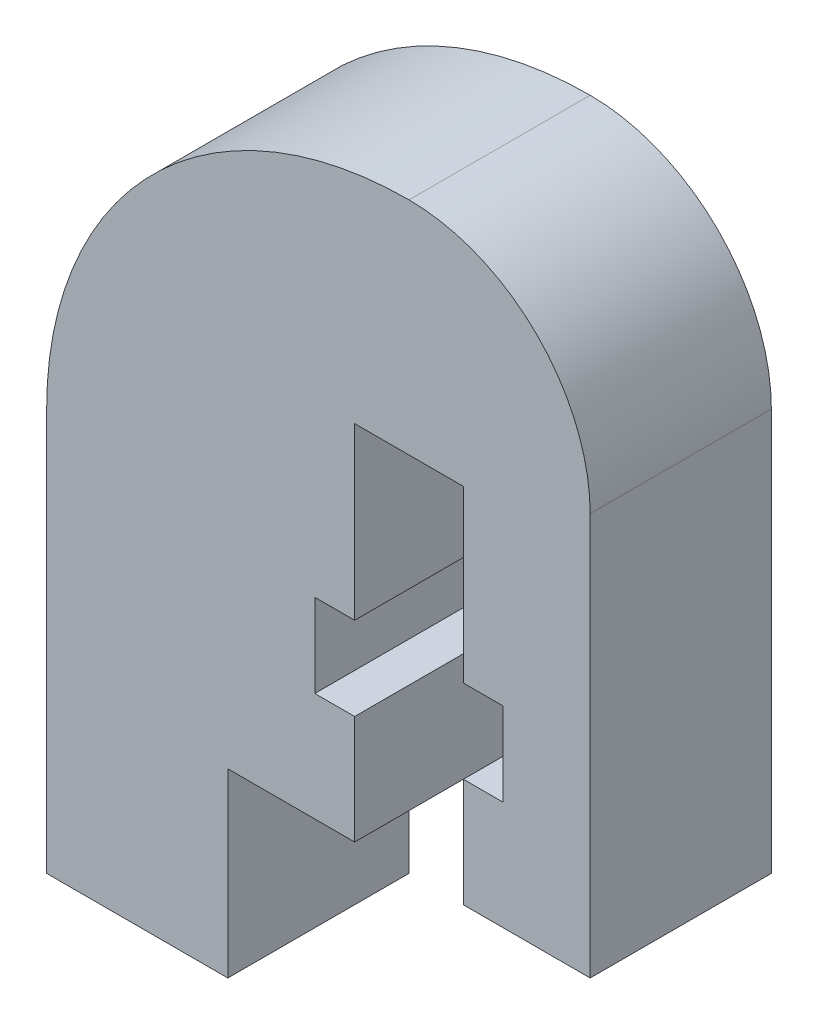
ISO-10303-21;
HEADER;
FILE_DESCRIPTION(('STEP AP214'),'2;1');
FILE_NAME('part.step','',(''),(''),'','','');
FILE_SCHEMA(('AUTOMOTIVE_DESIGN { 1 0 10303 214 1 1 1 1 }'));
ENDSEC;
DATA;
#1=APPLICATION_CONTEXT('core data for automotive mechanical design processes');
#2=APPLICATION_PROTOCOL_DEFINITION('international standard','automotive_design',2000,#1);
#3=PRODUCT_CONTEXT('',#1,'mechanical');
#4=PRODUCT('Part','Part','',(#3));
#5=PRODUCT_RELATED_PRODUCT_CATEGORY('part','',(#4));
#6=PRODUCT_DEFINITION_FORMATION('','',#4);
#7=PRODUCT_DEFINITION_CONTEXT('part definition',#1,'design');
#8=PRODUCT_DEFINITION('design','',#6,#7);
#9=PRODUCT_DEFINITION_SHAPE('','',#8);
#10=(LENGTH_UNIT() NAMED_UNIT(*) SI_UNIT(.MILLI.,.METRE.));
#11=(NAMED_UNIT(*) PLANE_ANGLE_UNIT() SI_UNIT($,.RADIAN.));
#12=(NAMED_UNIT(*) SI_UNIT($,.STERADIAN.) SOLID_ANGLE_UNIT());
#13=UNCERTAINTY_MEASURE_WITH_UNIT(LENGTH_MEASURE(1.E-05),#10,'distance_accuracy_value','');
#14=(GEOMETRIC_REPRESENTATION_CONTEXT(3) GLOBAL_UNCERTAINTY_ASSIGNED_CONTEXT((#13)) GLOBAL_UNIT_ASSIGNED_CONTEXT((#10,
#11,#12)) REPRESENTATION_CONTEXT('',''));
#15=CARTESIAN_POINT('',(0.,0.,0.));
#16=DIRECTION('',(0.,0.,1.));
#17=DIRECTION('',(1.,0.,0.));
#18=AXIS2_PLACEMENT_3D('',#15,#16,#17);
#19=CARTESIAN_POINT('',(-18.4847998634987,8.,5.));
#20=DIRECTION('',(-1.,0.,0.));
#21=DIRECTION('',(0.,0.,1.));
#22=AXIS2_PLACEMENT_3D('',#19,#20,#21);
#23=PLANE('',#22);
#24=DIRECTION('',(0.,1.,0.));
#25=VECTOR('',#24,1.);
#26=CARTESIAN_POINT('',(-18.4847998634987,8.,0.));
#27=LINE('',#26,#25);
#28=CARTESIAN_POINT('',(-18.4847998634987,5.,0.));
#29=VERTEX_POINT('',#28);
#30=CARTESIAN_POINT('',(-18.4847998634987,8.,0.));
#31=VERTEX_POINT('',#30);
#32=EDGE_CURVE('E187',#29,#31,#27,.T.);
#33=ORIENTED_EDGE('',*,*,#32,.T.);
#34=DIRECTION('',(0.,0.,-1.));
#35=VECTOR('',#34,1.);
#36=CARTESIAN_POINT('',(-18.4847998634987,8.,5.));
#37=LINE('',#36,#35);
#38=CARTESIAN_POINT('',(-18.4847998634987,8.,5.));
#39=VERTEX_POINT('',#38);
#40=EDGE_CURVE('E168',#39,#31,#37,.T.);
#41=ORIENTED_EDGE('',*,*,#40,.F.);
#42=DIRECTION('',(0.,1.,0.));
#43=VECTOR('',#42,1.);
#44=CARTESIAN_POINT('',(-18.4847998634987,8.,5.));
#45=LINE('',#44,#43);
#46=CARTESIAN_POINT('',(-18.4847998634987,5.,5.));
#47=VERTEX_POINT('',#46);
#48=EDGE_CURVE('E175',#47,#39,#45,.T.);
#49=ORIENTED_EDGE('',*,*,#48,.F.);
#50=DIRECTION('',(0.,0.,-1.));
#51=VECTOR('',#50,1.);
#52=CARTESIAN_POINT('',(-18.4847998634987,5.,5.));
#53=LINE('',#52,#51);
#54=EDGE_CURVE('E236',#47,#29,#53,.T.);
#55=ORIENTED_EDGE('',*,*,#54,.T.);
#56=EDGE_LOOP('',(#33,#41,#49,#55));
#57=FACE_BOUND('',#56,.T.);
#58=ADVANCED_FACE('F33',(#57),#23,.F.);
#59=CARTESIAN_POINT('',(-18.4847998634987,8.,5.));
#60=DIRECTION('',(0.,-1.,0.));
#61=DIRECTION('',(1.,0.,0.));
#62=AXIS2_PLACEMENT_3D('',#59,#60,#61);
#63=PLANE('',#62);
#64=DIRECTION('',(-1.,0.,0.));
#65=VECTOR('',#64,1.);
#66=CARTESIAN_POINT('',(-18.4847998634987,8.,0.));
#67=LINE('',#66,#65);
#68=CARTESIAN_POINT('',(-19.5847998634987,8.00000000000001,0.));
#69=VERTEX_POINT('',#68);
#70=EDGE_CURVE('E289',#31,#69,#67,.T.);
#71=ORIENTED_EDGE('',*,*,#70,.T.);
#72=DIRECTION('',(0.,0.,-1.));
#73=VECTOR('',#72,1.);
#74=CARTESIAN_POINT('',(-19.5847998634987,8.00000000000001,5.));
#75=LINE('',#74,#73);
#76=CARTESIAN_POINT('',(-19.5847998634987,8.00000000000001,5.));
#77=VERTEX_POINT('',#76);
#78=EDGE_CURVE('E171',#77,#69,#75,.T.);
#79=ORIENTED_EDGE('',*,*,#78,.F.);
#80=DIRECTION('',(-1.,0.,0.));
#81=VECTOR('',#80,1.);
#82=CARTESIAN_POINT('',(-18.4847998634987,8.,5.));
#83=LINE('',#82,#81);
#84=EDGE_CURVE('E164',#39,#77,#83,.T.);
#85=ORIENTED_EDGE('',*,*,#84,.F.);
#86=ORIENTED_EDGE('',*,*,#40,.T.);
#87=EDGE_LOOP('',(#71,#79,#85,#86));
#88=FACE_BOUND('',#87,.T.);
#89=ADVANCED_FACE('F166',(#88),#63,.F.);
#90=CARTESIAN_POINT('',(-19.5847998634987,8.00000000000001,5.));
#91=DIRECTION('',(-1.,0.,0.));
#92=DIRECTION('',(0.,0.,1.));
#93=AXIS2_PLACEMENT_3D('',#90,#91,#92);
#94=PLANE('',#93);
#95=DIRECTION('',(0.,1.,0.));
#96=VECTOR('',#95,1.);
#97=CARTESIAN_POINT('',(-19.5847998634987,8.00000000000001,0.));
#98=LINE('',#97,#96);
#99=CARTESIAN_POINT('',(-19.5847998634987,10.3,0.));
#100=VERTEX_POINT('',#99);
#101=EDGE_CURVE('E283',#69,#100,#98,.T.);
#102=ORIENTED_EDGE('',*,*,#101,.T.);
#103=DIRECTION('',(0.,0.,-1.));
#104=VECTOR('',#103,1.);
#105=CARTESIAN_POINT('',(-19.5847998634987,10.3,5.));
#106=LINE('',#105,#104);
#107=CARTESIAN_POINT('',(-19.5847998634987,10.3,5.));
#108=VERTEX_POINT('',#107);
#109=EDGE_CURVE('E193',#108,#100,#106,.T.);
#110=ORIENTED_EDGE('',*,*,#109,.F.);
#111=DIRECTION('',(0.,1.,0.));
#112=VECTOR('',#111,1.);
#113=CARTESIAN_POINT('',(-19.5847998634987,8.00000000000001,5.));
#114=LINE('',#113,#112);
#115=EDGE_CURVE('E174',#77,#108,#114,.T.);
#116=ORIENTED_EDGE('',*,*,#115,.F.);
#117=ORIENTED_EDGE('',*,*,#78,.T.);
#118=EDGE_LOOP('',(#102,#110,#116,#117));
#119=FACE_BOUND('',#118,.T.);
#120=ADVANCED_FACE('F321',(#119),#94,.F.);
#121=CARTESIAN_POINT('',(-19.5847998634987,10.3,5.));
#122=DIRECTION('',(0.,1.,0.));
#123=DIRECTION('',(-1.,0.,0.));
#124=AXIS2_PLACEMENT_3D('',#121,#122,#123);
#125=PLANE('',#124);
#126=DIRECTION('',(1.,0.,0.));
#127=VECTOR('',#126,1.);
#128=CARTESIAN_POINT('',(-19.5847998634987,10.3,0.));
#129=LINE('',#128,#127);
#130=CARTESIAN_POINT('',(-18.4847998634987,10.3,0.));
#131=VERTEX_POINT('',#130);
#132=EDGE_CURVE('E278',#100,#131,#129,.T.);
#133=ORIENTED_EDGE('',*,*,#132,.T.);
#134=DIRECTION('',(0.,0.,-1.));
#135=VECTOR('',#134,1.);
#136=CARTESIAN_POINT('',(-18.4847998634987,10.3,5.));
#137=LINE('',#136,#135);
#138=CARTESIAN_POINT('',(-18.4847998634987,10.3,5.));
#139=VERTEX_POINT('',#138);
#140=EDGE_CURVE('E269',#139,#131,#137,.T.);
#141=ORIENTED_EDGE('',*,*,#140,.F.);
#142=DIRECTION('',(1.,0.,0.));
#143=VECTOR('',#142,1.);
#144=CARTESIAN_POINT('',(-19.5847998634987,10.3,5.));
#145=LINE('',#144,#143);
#146=EDGE_CURVE('E279',#108,#139,#145,.T.);
#147=ORIENTED_EDGE('',*,*,#146,.F.);
#148=ORIENTED_EDGE('',*,*,#109,.T.);
#149=EDGE_LOOP('',(#133,#141,#147,#148));
#150=FACE_BOUND('',#149,.T.);
#151=ADVANCED_FACE('F276',(#150),#125,.F.);
#152=CARTESIAN_POINT('',(-18.4847998634987,15.,5.));
#153=DIRECTION('',(-1.,0.,0.));
#154=DIRECTION('',(0.,0.,1.));
#155=AXIS2_PLACEMENT_3D('',#152,#153,#154);
#156=PLANE('',#155);
#157=DIRECTION('',(0.,1.,0.));
#158=VECTOR('',#157,1.);
#159=CARTESIAN_POINT('',(-18.4847998634987,15.,0.));
#160=LINE('',#159,#158);
#161=CARTESIAN_POINT('',(-18.4847998634987,15.,0.));
#162=VERTEX_POINT('',#161);
#163=EDGE_CURVE('E285',#131,#162,#160,.T.);
#164=ORIENTED_EDGE('',*,*,#163,.T.);
#165=DIRECTION('',(0.,0.,-1.));
#166=VECTOR('',#165,1.);
#167=CARTESIAN_POINT('',(-18.4847998634987,15.,5.));
#168=LINE('',#167,#166);
#169=CARTESIAN_POINT('',(-18.4847998634987,15.,5.));
#170=VERTEX_POINT('',#169);
#171=EDGE_CURVE('E266',#170,#162,#168,.T.);
#172=ORIENTED_EDGE('',*,*,#171,.F.);
#173=DIRECTION('',(0.,1.,0.));
#174=VECTOR('',#173,1.);
#175=CARTESIAN_POINT('',(-18.4847998634987,15.,5.));
#176=LINE('',#175,#174);
#177=EDGE_CURVE('E323',#139,#170,#176,.T.);
#178=ORIENTED_EDGE('',*,*,#177,.F.);
#179=ORIENTED_EDGE('',*,*,#140,.T.);
#180=EDGE_LOOP('',(#164,#172,#178,#179));
#181=FACE_BOUND('',#180,.T.);
#182=ADVANCED_FACE('F366',(#181),#156,.F.);
#183=CARTESIAN_POINT('',(-15.4847998634987,15.,5.));
#184=DIRECTION('',(0.,1.,0.));
#185=DIRECTION('',(0.,0.,1.));
#186=AXIS2_PLACEMENT_3D('',#183,#184,#185);
#187=PLANE('',#186);
#188=DIRECTION('',(1.,0.,0.));
#189=VECTOR('',#188,1.);
#190=CARTESIAN_POINT('',(-15.4847998634987,15.,0.));
#191=LINE('',#190,#189);
#192=CARTESIAN_POINT('',(-15.4847998634987,15.,0.));
#193=VERTEX_POINT('',#192);
#194=EDGE_CURVE('E287',#162,#193,#191,.T.);
#195=ORIENTED_EDGE('',*,*,#194,.T.);
#196=DIRECTION('',(0.,0.,-1.));
#197=VECTOR('',#196,1.);
#198=CARTESIAN_POINT('',(-15.4847998634987,15.,5.));
#199=LINE('',#198,#197);
#200=CARTESIAN_POINT('',(-15.4847998634987,15.,5.));
#201=VERTEX_POINT('',#200);
#202=EDGE_CURVE('E263',#201,#193,#199,.T.);
#203=ORIENTED_EDGE('',*,*,#202,.F.);
#204=DIRECTION('',(1.,0.,0.));
#205=VECTOR('',#204,1.);
#206=CARTESIAN_POINT('',(-15.4847998634987,15.,5.));
#207=LINE('',#206,#205);
#208=EDGE_CURVE('E327',#170,#201,#207,.T.);
#209=ORIENTED_EDGE('',*,*,#208,.F.);
#210=ORIENTED_EDGE('',*,*,#171,.T.);
#211=EDGE_LOOP('',(#195,#203,#209,#210));
#212=FACE_BOUND('',#211,.T.);
#213=ADVANCED_FACE('F362',(#212),#187,.F.);
#214=CARTESIAN_POINT('',(-15.4847998634987,10.3,5.));
#215=DIRECTION('',(1.,0.,0.));
#216=DIRECTION('',(0.,1.,0.));
#217=AXIS2_PLACEMENT_3D('',#214,#215,#216);
#218=PLANE('',#217);
#219=DIRECTION('',(0.,-1.,0.));
#220=VECTOR('',#219,1.);
#221=CARTESIAN_POINT('',(-15.4847998634987,10.3,0.));
#222=LINE('',#221,#220);
#223=CARTESIAN_POINT('',(-15.4847998634987,10.3,0.));
#224=VERTEX_POINT('',#223);
#225=EDGE_CURVE('E294',#193,#224,#222,.T.);
#226=ORIENTED_EDGE('',*,*,#225,.T.);
#227=DIRECTION('',(0.,0.,-1.));
#228=VECTOR('',#227,1.);
#229=CARTESIAN_POINT('',(-15.4847998634987,10.3,5.));
#230=LINE('',#229,#228);
#231=CARTESIAN_POINT('',(-15.4847998634987,10.3,5.));
#232=VERTEX_POINT('',#231);
#233=EDGE_CURVE('E260',#232,#224,#230,.T.);
#234=ORIENTED_EDGE('',*,*,#233,.F.);
#235=DIRECTION('',(0.,-1.,0.));
#236=VECTOR('',#235,1.);
#237=CARTESIAN_POINT('',(-15.4847998634987,10.3,5.));
#238=LINE('',#237,#236);
#239=EDGE_CURVE('E329',#201,#232,#238,.T.);
#240=ORIENTED_EDGE('',*,*,#239,.F.);
#241=ORIENTED_EDGE('',*,*,#202,.T.);
#242=EDGE_LOOP('',(#226,#234,#240,#241));
#243=FACE_BOUND('',#242,.T.);
#244=ADVANCED_FACE('F357',(#243),#218,.F.);
#245=CARTESIAN_POINT('',(-15.4847998634987,10.3,5.));
#246=DIRECTION('',(0.,1.,0.));
#247=DIRECTION('',(-1.,0.,0.));
#248=AXIS2_PLACEMENT_3D('',#245,#246,#247);
#249=PLANE('',#248);
#250=DIRECTION('',(1.,0.,0.));
#251=VECTOR('',#250,1.);
#252=CARTESIAN_POINT('',(-15.4847998634987,10.3,0.));
#253=LINE('',#252,#251);
#254=CARTESIAN_POINT('',(-14.3847998634987,10.3,0.));
#255=VERTEX_POINT('',#254);
#256=EDGE_CURVE('E296',#224,#255,#253,.T.);
#257=ORIENTED_EDGE('',*,*,#256,.T.);
#258=DIRECTION('',(0.,0.,-1.));
#259=VECTOR('',#258,1.);
#260=CARTESIAN_POINT('',(-14.3847998634987,10.3,5.));
#261=LINE('',#260,#259);
#262=CARTESIAN_POINT('',(-14.3847998634987,10.3,5.));
#263=VERTEX_POINT('',#262);
#264=EDGE_CURVE('E257',#263,#255,#261,.T.);
#265=ORIENTED_EDGE('',*,*,#264,.F.);
#266=DIRECTION('',(1.,0.,0.));
#267=VECTOR('',#266,1.);
#268=CARTESIAN_POINT('',(-15.4847998634987,10.3,5.));
#269=LINE('',#268,#267);
#270=EDGE_CURVE('E331',#232,#263,#269,.T.);
#271=ORIENTED_EDGE('',*,*,#270,.F.);
#272=ORIENTED_EDGE('',*,*,#233,.T.);
#273=EDGE_LOOP('',(#257,#265,#271,#272));
#274=FACE_BOUND('',#273,.T.);
#275=ADVANCED_FACE('F353',(#274),#249,.F.);
#276=CARTESIAN_POINT('',(-14.3847998634987,10.3,5.));
#277=DIRECTION('',(1.,0.,0.));
#278=DIRECTION('',(0.,1.,0.));
#279=AXIS2_PLACEMENT_3D('',#276,#277,#278);
#280=PLANE('',#279);
#281=DIRECTION('',(0.,-1.,0.));
#282=VECTOR('',#281,1.);
#283=CARTESIAN_POINT('',(-14.3847998634987,10.3,0.));
#284=LINE('',#283,#282);
#285=CARTESIAN_POINT('',(-14.3847998634987,8.,0.));
#286=VERTEX_POINT('',#285);
#287=EDGE_CURVE('E298',#255,#286,#284,.T.);
#288=ORIENTED_EDGE('',*,*,#287,.T.);
#289=DIRECTION('',(0.,0.,-1.));
#290=VECTOR('',#289,1.);
#291=CARTESIAN_POINT('',(-14.3847998634987,8.,5.));
#292=LINE('',#291,#290);
#293=CARTESIAN_POINT('',(-14.3847998634987,8.,5.));
#294=VERTEX_POINT('',#293);
#295=EDGE_CURVE('E254',#294,#286,#292,.T.);
#296=ORIENTED_EDGE('',*,*,#295,.F.);
#297=DIRECTION('',(0.,-1.,0.));
#298=VECTOR('',#297,1.);
#299=CARTESIAN_POINT('',(-14.3847998634987,10.3,5.));
#300=LINE('',#299,#298);
#301=EDGE_CURVE('E333',#263,#294,#300,.T.);
#302=ORIENTED_EDGE('',*,*,#301,.F.);
#303=ORIENTED_EDGE('',*,*,#264,.T.);
#304=EDGE_LOOP('',(#288,#296,#302,#303));
#305=FACE_BOUND('',#304,.T.);
#306=ADVANCED_FACE('F349',(#305),#280,.F.);
#307=CARTESIAN_POINT('',(-14.3847998634987,8.,5.));
#308=DIRECTION('',(0.,-1.,0.));
#309=DIRECTION('',(0.,0.,-1.));
#310=AXIS2_PLACEMENT_3D('',#307,#308,#309);
#311=PLANE('',#310);
#312=DIRECTION('',(-1.,0.,0.));
#313=VECTOR('',#312,1.);
#314=CARTESIAN_POINT('',(-14.3847998634987,8.,0.));
#315=LINE('',#314,#313);
#316=CARTESIAN_POINT('',(-15.4847998634987,8.,0.));
#317=VERTEX_POINT('',#316);
#318=EDGE_CURVE('E300',#286,#317,#315,.T.);
#319=ORIENTED_EDGE('',*,*,#318,.T.);
#320=DIRECTION('',(0.,0.,-1.));
#321=VECTOR('',#320,1.);
#322=CARTESIAN_POINT('',(-15.4847998634987,8.,5.));
#323=LINE('',#322,#321);
#324=CARTESIAN_POINT('',(-15.4847998634987,8.,5.));
#325=VERTEX_POINT('',#324);
#326=EDGE_CURVE('E251',#325,#317,#323,.T.);
#327=ORIENTED_EDGE('',*,*,#326,.F.);
#328=DIRECTION('',(-1.,0.,0.));
#329=VECTOR('',#328,1.);
#330=CARTESIAN_POINT('',(-14.3847998634987,8.,5.));
#331=LINE('',#330,#329);
#332=EDGE_CURVE('E335',#294,#325,#331,.T.);
#333=ORIENTED_EDGE('',*,*,#332,.F.);
#334=ORIENTED_EDGE('',*,*,#295,.T.);
#335=EDGE_LOOP('',(#319,#327,#333,#334));
#336=FACE_BOUND('',#335,.T.);
#337=ADVANCED_FACE('F345',(#336),#311,.F.);
#338=CARTESIAN_POINT('',(-15.4847998634987,5.,5.));
#339=DIRECTION('',(1.,0.,0.));
#340=DIRECTION('',(0.,1.,0.));
#341=AXIS2_PLACEMENT_3D('',#338,#339,#340);
#342=PLANE('',#341);
#343=DIRECTION('',(0.,-1.,0.));
#344=VECTOR('',#343,1.);
#345=CARTESIAN_POINT('',(-15.4847998634987,5.,0.));
#346=LINE('',#345,#344);
#347=CARTESIAN_POINT('',(-15.4847998634987,5.,0.));
#348=VERTEX_POINT('',#347);
#349=EDGE_CURVE('E302',#317,#348,#346,.T.);
#350=ORIENTED_EDGE('',*,*,#349,.T.);
#351=DIRECTION('',(0.,0.,-1.));
#352=VECTOR('',#351,1.);
#353=CARTESIAN_POINT('',(-15.4847998634987,5.,5.));
#354=LINE('',#353,#352);
#355=CARTESIAN_POINT('',(-15.4847998634987,5.,5.));
#356=VERTEX_POINT('',#355);
#357=EDGE_CURVE('E248',#356,#348,#354,.T.);
#358=ORIENTED_EDGE('',*,*,#357,.F.);
#359=DIRECTION('',(0.,-1.,0.));
#360=VECTOR('',#359,1.);
#361=CARTESIAN_POINT('',(-15.4847998634987,5.,5.));
#362=LINE('',#361,#360);
#363=EDGE_CURVE('E313',#325,#356,#362,.T.);
#364=ORIENTED_EDGE('',*,*,#363,.F.);
#365=ORIENTED_EDGE('',*,*,#326,.T.);
#366=EDGE_LOOP('',(#350,#358,#364,#365));
#367=FACE_BOUND('',#366,.T.);
#368=ADVANCED_FACE('F340',(#367),#342,.F.);
#369=CARTESIAN_POINT('',(-15.4847998634987,5.,5.));
#370=DIRECTION('',(0.,1.,0.));
#371=DIRECTION('',(0.,0.,1.));
#372=AXIS2_PLACEMENT_3D('',#369,#370,#371);
#373=PLANE('',#372);
#374=DIRECTION('',(1.,0.,0.));
#375=VECTOR('',#374,1.);
#376=CARTESIAN_POINT('',(-15.4847998634987,5.,0.));
#377=LINE('',#376,#375);
#378=CARTESIAN_POINT('',(-11.9847998634987,5.,0.));
#379=VERTEX_POINT('',#378);
#380=EDGE_CURVE('E230',#348,#379,#377,.T.);
#381=ORIENTED_EDGE('',*,*,#380,.T.);
#382=DIRECTION('',(0.,0.,-1.));
#383=VECTOR('',#382,1.);
#384=CARTESIAN_POINT('',(-11.9847998634987,5.,5.));
#385=LINE('',#384,#383);
#386=CARTESIAN_POINT('',(-11.9847998634987,5.,5.));
#387=VERTEX_POINT('',#386);
#388=EDGE_CURVE('E245',#387,#379,#385,.T.);
#389=ORIENTED_EDGE('',*,*,#388,.F.);
#390=DIRECTION('',(1.,0.,0.));
#391=VECTOR('',#390,1.);
#392=CARTESIAN_POINT('',(-15.4847998634987,5.,5.));
#393=LINE('',#392,#391);
#394=EDGE_CURVE('E311',#356,#387,#393,.T.);
#395=ORIENTED_EDGE('',*,*,#394,.F.);
#396=ORIENTED_EDGE('',*,*,#357,.T.);
#397=EDGE_LOOP('',(#381,#389,#395,#396));
#398=FACE_BOUND('',#397,.T.);
#399=ADVANCED_FACE('F306',(#398),#373,.F.);
#400=CARTESIAN_POINT('',(-11.9847998634987,5.,5.));
#401=DIRECTION('',(-1.,0.,0.));
#402=DIRECTION('',(0.,0.,1.));
#403=AXIS2_PLACEMENT_3D('',#400,#401,#402);
#404=PLANE('',#403);
#405=DIRECTION('',(0.,1.,0.));
#406=VECTOR('',#405,1.);
#407=CARTESIAN_POINT('',(-11.9847998634987,5.,0.));
#408=LINE('',#407,#406);
#409=CARTESIAN_POINT('',(-11.9847998634987,16.0973849086642,0.));
#410=VERTEX_POINT('',#409);
#411=EDGE_CURVE('E226',#379,#410,#408,.T.);
#412=ORIENTED_EDGE('',*,*,#411,.T.);
#413=DIRECTION('',(0.,0.,-1.));
#414=VECTOR('',#413,1.);
#415=CARTESIAN_POINT('',(-11.9847998634987,16.0973849086642,5.));
#416=LINE('',#415,#414);
#417=CARTESIAN_POINT('',(-11.9847998634987,16.0973849086642,5.));
#418=VERTEX_POINT('',#417);
#419=EDGE_CURVE('E41',#410,#418,#416,.F.);
#420=ORIENTED_EDGE('',*,*,#419,.T.);
#421=DIRECTION('',(0.,1.,0.));
#422=VECTOR('',#421,1.);
#423=CARTESIAN_POINT('',(-11.9847998634987,5.,5.));
#424=LINE('',#423,#422);
#425=EDGE_CURVE('E218',#387,#418,#424,.T.);
#426=ORIENTED_EDGE('',*,*,#425,.F.);
#427=ORIENTED_EDGE('',*,*,#388,.T.);
#428=EDGE_LOOP('',(#412,#420,#426,#427));
#429=FACE_BOUND('',#428,.T.);
#430=ADVANCED_FACE('F310',(#429),#404,.F.);
#431=CARTESIAN_POINT('',(-26.9847998634987,0.,5.));
#432=DIRECTION('',(1.,0.,0.));
#433=DIRECTION('',(0.,0.,-1.));
#434=AXIS2_PLACEMENT_3D('',#431,#432,#433);
#435=PLANE('',#434);
#436=DIRECTION('',(0.,-1.,0.));
#437=VECTOR('',#436,1.);
#438=CARTESIAN_POINT('',(-26.9847998634987,5.,5.));
#439=LINE('',#438,#437);
#440=CARTESIAN_POINT('',(-26.9847998634987,11.0973849086642,5.));
#441=VERTEX_POINT('',#440);
#442=CARTESIAN_POINT('',(-26.9847998634987,0.,5.));
#443=VERTEX_POINT('',#442);
#444=EDGE_CURVE('E205',#441,#443,#439,.T.);
#445=ORIENTED_EDGE('',*,*,#444,.F.);
#446=DIRECTION('',(0.,0.,-1.));
#447=VECTOR('',#446,1.);
#448=CARTESIAN_POINT('',(-26.9847998634987,11.0973849086642,5.));
#449=LINE('',#448,#447);
#450=CARTESIAN_POINT('',(-26.9847998634987,11.0973849086642,0.));
#451=VERTEX_POINT('',#450);
#452=EDGE_CURVE('E188',#441,#451,#449,.T.);
#453=ORIENTED_EDGE('',*,*,#452,.T.);
#454=DIRECTION('',(0.,-1.,0.));
#455=VECTOR('',#454,1.);
#456=CARTESIAN_POINT('',(-26.9847998634987,0.,0.));
#457=LINE('',#456,#455);
#458=CARTESIAN_POINT('',(-26.9847998634987,0.,0.));
#459=VERTEX_POINT('',#458);
#460=EDGE_CURVE('E223',#451,#459,#457,.T.);
#461=ORIENTED_EDGE('',*,*,#460,.T.);
#462=DIRECTION('',(0.,0.,-1.));
#463=VECTOR('',#462,1.);
#464=CARTESIAN_POINT('',(-26.9847998634987,0.,5.));
#465=LINE('',#464,#463);
#466=EDGE_CURVE('E215',#443,#459,#465,.T.);
#467=ORIENTED_EDGE('',*,*,#466,.F.);
#468=EDGE_LOOP('',(#445,#453,#461,#467));
#469=FACE_BOUND('',#468,.T.);
#470=ADVANCED_FACE('F212',(#469),#435,.F.);
#471=CARTESIAN_POINT('',(-21.9847998634987,0.,5.));
#472=DIRECTION('',(0.,1.,0.));
#473=DIRECTION('',(0.,0.,1.));
#474=AXIS2_PLACEMENT_3D('',#471,#472,#473);
#475=PLANE('',#474);
#476=DIRECTION('',(1.,0.,0.));
#477=VECTOR('',#476,1.);
#478=CARTESIAN_POINT('',(-21.9847998634987,0.,0.));
#479=LINE('',#478,#477);
#480=CARTESIAN_POINT('',(-21.9847998634987,0.,0.));
#481=VERTEX_POINT('',#480);
#482=EDGE_CURVE('E225',#459,#481,#479,.T.);
#483=ORIENTED_EDGE('',*,*,#482,.T.);
#484=DIRECTION('',(0.,0.,-1.));
#485=VECTOR('',#484,1.);
#486=CARTESIAN_POINT('',(-21.9847998634987,0.,5.));
#487=LINE('',#486,#485);
#488=CARTESIAN_POINT('',(-21.9847998634987,0.,5.));
#489=VERTEX_POINT('',#488);
#490=EDGE_CURVE('E241',#489,#481,#487,.T.);
#491=ORIENTED_EDGE('',*,*,#490,.F.);
#492=DIRECTION('',(1.,0.,0.));
#493=VECTOR('',#492,1.);
#494=CARTESIAN_POINT('',(-21.9847998634987,0.,5.));
#495=LINE('',#494,#493);
#496=EDGE_CURVE('E217',#443,#489,#495,.T.);
#497=ORIENTED_EDGE('',*,*,#496,.F.);
#498=ORIENTED_EDGE('',*,*,#466,.T.);
#499=EDGE_LOOP('',(#483,#491,#497,#498));
#500=FACE_BOUND('',#499,.T.);
#501=ADVANCED_FACE('F401',(#500),#475,.F.);
#502=CARTESIAN_POINT('',(-21.9847998634987,0.,5.));
#503=DIRECTION('',(-1.,0.,0.));
#504=DIRECTION('',(0.,0.,1.));
#505=AXIS2_PLACEMENT_3D('',#502,#503,#504);
#506=PLANE('',#505);
#507=DIRECTION('',(0.,1.,0.));
#508=VECTOR('',#507,1.);
#509=CARTESIAN_POINT('',(-21.9847998634987,0.,0.));
#510=LINE('',#509,#508);
#511=CARTESIAN_POINT('',(-21.9847998634987,5.,0.));
#512=VERTEX_POINT('',#511);
#513=EDGE_CURVE('E228',#481,#512,#510,.T.);
#514=ORIENTED_EDGE('',*,*,#513,.T.);
#515=DIRECTION('',(0.,0.,-1.));
#516=VECTOR('',#515,1.);
#517=CARTESIAN_POINT('',(-21.9847998634987,5.,5.));
#518=LINE('',#517,#516);
#519=CARTESIAN_POINT('',(-21.9847998634987,5.,5.));
#520=VERTEX_POINT('',#519);
#521=EDGE_CURVE('E238',#520,#512,#518,.T.);
#522=ORIENTED_EDGE('',*,*,#521,.F.);
#523=DIRECTION('',(0.,1.,0.));
#524=VECTOR('',#523,1.);
#525=CARTESIAN_POINT('',(-21.9847998634987,0.,5.));
#526=LINE('',#525,#524);
#527=EDGE_CURVE('E318',#489,#520,#526,.T.);
#528=ORIENTED_EDGE('',*,*,#527,.F.);
#529=ORIENTED_EDGE('',*,*,#490,.T.);
#530=EDGE_LOOP('',(#514,#522,#528,#529));
#531=FACE_BOUND('',#530,.T.);
#532=ADVANCED_FACE('F397',(#531),#506,.F.);
#533=CARTESIAN_POINT('',(-18.4847998634987,5.,5.));
#534=DIRECTION('',(0.,1.,0.));
#535=DIRECTION('',(-1.,0.,0.));
#536=AXIS2_PLACEMENT_3D('',#533,#534,#535);
#537=PLANE('',#536);
#538=DIRECTION('',(1.,0.,0.));
#539=VECTOR('',#538,1.);
#540=CARTESIAN_POINT('',(-18.4847998634987,5.,0.));
#541=LINE('',#540,#539);
#542=EDGE_CURVE('E184',#512,#29,#541,.T.);
#543=ORIENTED_EDGE('',*,*,#542,.T.);
#544=ORIENTED_EDGE('',*,*,#54,.F.);
#545=DIRECTION('',(1.,0.,0.));
#546=VECTOR('',#545,1.);
#547=CARTESIAN_POINT('',(-18.4847998634987,5.,5.));
#548=LINE('',#547,#546);
#549=EDGE_CURVE('E180',#520,#47,#548,.T.);
#550=ORIENTED_EDGE('',*,*,#549,.F.);
#551=ORIENTED_EDGE('',*,*,#521,.T.);
#552=EDGE_LOOP('',(#543,#544,#550,#551));
#553=FACE_BOUND('',#552,.T.);
#554=ADVANCED_FACE('F392',(#553),#537,.F.);
#555=CARTESIAN_POINT('',(0.,0.,5.));
#556=DIRECTION('',(0.,0.,-1.));
#557=DIRECTION('',(-1.,0.,0.));
#558=AXIS2_PLACEMENT_3D('',#555,#556,#557);
#559=PLANE('',#558);
#560=ORIENTED_EDGE('',*,*,#425,.T.);
#561=CARTESIAN_POINT('',(-16.9847998634987,16.0973849086642,5.));
#562=DIRECTION('',(0.,0.,-1.));
#563=DIRECTION('',(-1.,0.,0.));
#564=AXIS2_PLACEMENT_3D('',#561,#562,#563);
#565=CIRCLE('',#564,5.);
#566=CARTESIAN_POINT('',(-16.9847998634987,21.0973849086642,5.));
#567=VERTEX_POINT('',#566);
#568=EDGE_CURVE('E11',#418,#567,#565,.F.);
#569=ORIENTED_EDGE('',*,*,#568,.T.);
#570=CARTESIAN_POINT('',(-16.9847998634987,11.0973849086642,5.));
#571=DIRECTION('',(0.,0.,-1.));
#572=DIRECTION('',(-1.,0.,0.));
#573=AXIS2_PLACEMENT_3D('',#570,#571,#572);
#574=CIRCLE('',#573,10.);
#575=EDGE_CURVE('E201',#567,#441,#574,.F.);
#576=ORIENTED_EDGE('',*,*,#575,.T.);
#577=ORIENTED_EDGE('',*,*,#444,.T.);
#578=ORIENTED_EDGE('',*,*,#496,.T.);
#579=ORIENTED_EDGE('',*,*,#527,.T.);
#580=ORIENTED_EDGE('',*,*,#549,.T.);
#581=ORIENTED_EDGE('',*,*,#48,.T.);
#582=ORIENTED_EDGE('',*,*,#84,.T.);
#583=ORIENTED_EDGE('',*,*,#115,.T.);
#584=ORIENTED_EDGE('',*,*,#146,.T.);
#585=ORIENTED_EDGE('',*,*,#177,.T.);
#586=ORIENTED_EDGE('',*,*,#208,.T.);
#587=ORIENTED_EDGE('',*,*,#239,.T.);
#588=ORIENTED_EDGE('',*,*,#270,.T.);
#589=ORIENTED_EDGE('',*,*,#301,.T.);
#590=ORIENTED_EDGE('',*,*,#332,.T.);
#591=ORIENTED_EDGE('',*,*,#363,.T.);
#592=ORIENTED_EDGE('',*,*,#394,.T.);
#593=EDGE_LOOP('',(#560,#569,#576,#577,#578,#579,#580,#581,#582,#583,#584,#585,#586,#587,#588,
#589,#590,#591,#592));
#594=FACE_BOUND('',#593,.T.);
#595=ADVANCED_FACE('F178',(#594),#559,.F.);
#596=CARTESIAN_POINT('',(0.,0.,0.));
#597=DIRECTION('',(0.,0.,-1.));
#598=DIRECTION('',(-1.,0.,0.));
#599=AXIS2_PLACEMENT_3D('',#596,#597,#598);
#600=PLANE('',#599);
#601=CARTESIAN_POINT('',(-16.9847998634987,11.0973849086642,0.));
#602=DIRECTION('',(0.,0.,-1.));
#603=DIRECTION('',(-1.,0.,0.));
#604=AXIS2_PLACEMENT_3D('',#601,#602,#603);
#605=CIRCLE('',#604,10.);
#606=CARTESIAN_POINT('',(-16.9847998634987,21.0973849086642,0.));
#607=VERTEX_POINT('',#606);
#608=EDGE_CURVE('E191',#451,#607,#605,.T.);
#609=ORIENTED_EDGE('',*,*,#608,.T.);
#610=CARTESIAN_POINT('',(-16.9847998634987,16.0973849086642,0.));
#611=DIRECTION('',(0.,0.,-1.));
#612=DIRECTION('',(-1.,0.,0.));
#613=AXIS2_PLACEMENT_3D('',#610,#611,#612);
#614=CIRCLE('',#613,5.);
#615=EDGE_CURVE('E55',#607,#410,#614,.T.);
#616=ORIENTED_EDGE('',*,*,#615,.T.);
#617=ORIENTED_EDGE('',*,*,#411,.F.);
#618=ORIENTED_EDGE('',*,*,#380,.F.);
#619=ORIENTED_EDGE('',*,*,#349,.F.);
#620=ORIENTED_EDGE('',*,*,#318,.F.);
#621=ORIENTED_EDGE('',*,*,#287,.F.);
#622=ORIENTED_EDGE('',*,*,#256,.F.);
#623=ORIENTED_EDGE('',*,*,#225,.F.);
#624=ORIENTED_EDGE('',*,*,#194,.F.);
#625=ORIENTED_EDGE('',*,*,#163,.F.);
#626=ORIENTED_EDGE('',*,*,#132,.F.);
#627=ORIENTED_EDGE('',*,*,#101,.F.);
#628=ORIENTED_EDGE('',*,*,#70,.F.);
#629=ORIENTED_EDGE('',*,*,#32,.F.);
#630=ORIENTED_EDGE('',*,*,#542,.F.);
#631=ORIENTED_EDGE('',*,*,#513,.F.);
#632=ORIENTED_EDGE('',*,*,#482,.F.);
#633=ORIENTED_EDGE('',*,*,#460,.F.);
#634=EDGE_LOOP('',(#609,#616,#617,#618,#619,#620,#621,#622,#623,#624,#625,#626,#627,#628,#629,
#630,#631,#632,#633));
#635=FACE_BOUND('',#634,.T.);
#636=ADVANCED_FACE('F221',(#635),#600,.T.);
#637=CARTESIAN_POINT('',(-16.9847998634987,11.0973849086642,5.));
#638=DIRECTION('',(0.,0.,-1.));
#639=DIRECTION('',(-1.,0.,0.));
#640=AXIS2_PLACEMENT_3D('',#637,#638,#639);
#641=CYLINDRICAL_SURFACE('',#640,10.);
#642=ORIENTED_EDGE('',*,*,#575,.F.);
#643=DIRECTION('',(0.,0.,-1.));
#644=VECTOR('',#643,1.);
#645=CARTESIAN_POINT('',(-16.9847998634987,21.0973849086642,5.));
#646=LINE('',#645,#644);
#647=EDGE_CURVE('E198',#607,#567,#646,.F.);
#648=ORIENTED_EDGE('',*,*,#647,.F.);
#649=ORIENTED_EDGE('',*,*,#608,.F.);
#650=ORIENTED_EDGE('',*,*,#452,.F.);
#651=EDGE_LOOP('',(#642,#648,#649,#650));
#652=FACE_BOUND('',#651,.T.);
#653=ADVANCED_FACE('F220',(#652),#641,.T.);
#654=CARTESIAN_POINT('',(-16.9847998634987,16.0973849086642,5.));
#655=DIRECTION('',(0.,0.,-1.));
#656=DIRECTION('',(-1.,0.,0.));
#657=AXIS2_PLACEMENT_3D('',#654,#655,#656);
#658=CYLINDRICAL_SURFACE('',#657,5.);
#659=ORIENTED_EDGE('',*,*,#568,.F.);
#660=ORIENTED_EDGE('',*,*,#419,.F.);
#661=ORIENTED_EDGE('',*,*,#615,.F.);
#662=ORIENTED_EDGE('',*,*,#647,.T.);
#663=EDGE_LOOP('',(#659,#660,#661,#662));
#664=FACE_BOUND('',#663,.T.);
#665=ADVANCED_FACE('F35',(#664),#658,.T.);
#666=CLOSED_SHELL('',(#58,#89,#120,#151,#182,#213,#244,#275,#306,#337,#368,#399,#430,#470,#501,
#532,#554,#595,#636,#653,#665));
#667=MANIFOLD_SOLID_BREP('B2',#666);
#668=ADVANCED_BREP_SHAPE_REPRESENTATION('',(#18,#667),#14);
#669=SHAPE_DEFINITION_REPRESENTATION(#9,#668);
ENDSEC;
END-ISO-10303-21;
